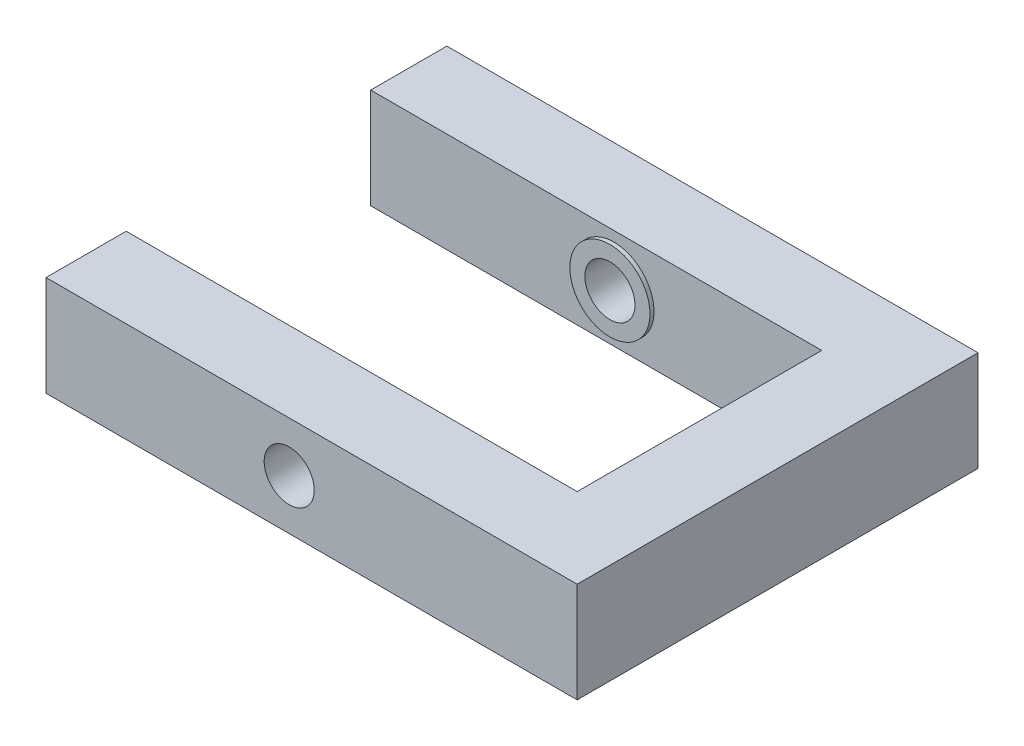
ISO-10303-21;
HEADER;
FILE_DESCRIPTION(('STEP AP214'),'2;1');
FILE_NAME('part.step','',(''),(''),'','','');
FILE_SCHEMA(('AUTOMOTIVE_DESIGN { 1 0 10303 214 1 1 1 1 }'));
ENDSEC;
DATA;
#1=APPLICATION_CONTEXT('core data for automotive mechanical design processes');
#2=APPLICATION_PROTOCOL_DEFINITION('international standard','automotive_design',2000,#1);
#3=PRODUCT_CONTEXT('',#1,'mechanical');
#4=PRODUCT('Part','Part','',(#3));
#5=PRODUCT_RELATED_PRODUCT_CATEGORY('part','',(#4));
#6=PRODUCT_DEFINITION_FORMATION('','',#4);
#7=PRODUCT_DEFINITION_CONTEXT('part definition',#1,'design');
#8=PRODUCT_DEFINITION('design','',#6,#7);
#9=PRODUCT_DEFINITION_SHAPE('','',#8);
#10=(LENGTH_UNIT() NAMED_UNIT(*) SI_UNIT(.MILLI.,.METRE.));
#11=(NAMED_UNIT(*) PLANE_ANGLE_UNIT() SI_UNIT($,.RADIAN.));
#12=(NAMED_UNIT(*) SI_UNIT($,.STERADIAN.) SOLID_ANGLE_UNIT());
#13=UNCERTAINTY_MEASURE_WITH_UNIT(LENGTH_MEASURE(1.E-05),#10,'distance_accuracy_value','');
#14=(GEOMETRIC_REPRESENTATION_CONTEXT(3) GLOBAL_UNCERTAINTY_ASSIGNED_CONTEXT((#13)) GLOBAL_UNIT_ASSIGNED_CONTEXT((#10,
#11,#12)) REPRESENTATION_CONTEXT('',''));
#15=CARTESIAN_POINT('',(0.,0.,0.));
#16=DIRECTION('',(0.,0.,1.));
#17=DIRECTION('',(1.,0.,0.));
#18=AXIS2_PLACEMENT_3D('',#15,#16,#17);
#19=CARTESIAN_POINT('',(0.,10.,-12.4));
#20=DIRECTION('',(0.,0.,-1.));
#21=DIRECTION('',(-1.,0.,0.));
#22=AXIS2_PLACEMENT_3D('',#19,#20,#21);
#23=PLANE('',#22);
#24=DIRECTION('',(1.,0.,0.));
#25=VECTOR('',#24,1.);
#26=CARTESIAN_POINT('',(0.,0.,-12.4));
#27=LINE('',#26,#25);
#28=CARTESIAN_POINT('',(0.,0.,-12.4));
#29=VERTEX_POINT('',#28);
#30=CARTESIAN_POINT('',(45.,0.,-12.4));
#31=VERTEX_POINT('',#30);
#32=EDGE_CURVE('E95',#29,#31,#27,.T.);
#33=ORIENTED_EDGE('',*,*,#32,.T.);
#34=DIRECTION('',(0.,-1.,0.));
#35=VECTOR('',#34,1.);
#36=CARTESIAN_POINT('',(45.,10.,-12.4));
#37=LINE('',#36,#35);
#38=CARTESIAN_POINT('',(45.,10.,-12.4));
#39=VERTEX_POINT('',#38);
#40=EDGE_CURVE('E139',#39,#31,#37,.T.);
#41=ORIENTED_EDGE('',*,*,#40,.F.);
#42=DIRECTION('',(1.,0.,0.));
#43=VECTOR('',#42,1.);
#44=CARTESIAN_POINT('',(0.,10.,-12.4));
#45=LINE('',#44,#43);
#46=CARTESIAN_POINT('',(0.,10.,-12.4));
#47=VERTEX_POINT('',#46);
#48=EDGE_CURVE('E137',#47,#39,#45,.T.);
#49=ORIENTED_EDGE('',*,*,#48,.F.);
#50=DIRECTION('',(0.,-1.,0.));
#51=VECTOR('',#50,1.);
#52=CARTESIAN_POINT('',(0.,10.,-12.4));
#53=LINE('',#52,#51);
#54=EDGE_CURVE('E133',#47,#29,#53,.T.);
#55=ORIENTED_EDGE('',*,*,#54,.T.);
#56=EDGE_LOOP('',(#33,#41,#49,#55));
#57=FACE_BOUND('',#56,.T.);
#58=CARTESIAN_POINT('',(24.27,5.,-12.4));
#59=DIRECTION('',(0.,0.,-1.));
#60=DIRECTION('',(-1.,0.,0.));
#61=AXIS2_PLACEMENT_3D('',#58,#59,#60);
#62=CIRCLE('',#61,4.);
#63=CARTESIAN_POINT('',(20.27,5.,-12.4));
#64=VERTEX_POINT('',#63);
#65=EDGE_CURVE('E11',#64,#64,#62,.F.);
#66=ORIENTED_EDGE('',*,*,#65,.F.);
#67=EDGE_LOOP('',(#66));
#68=FACE_BOUND('',#67,.T.);
#69=ADVANCED_FACE('F41',(#57,#68),#23,.F.);
#70=CARTESIAN_POINT('',(0.,10.,12.));
#71=DIRECTION('',(0.,0.,1.));
#72=DIRECTION('',(1.,0.,0.));
#73=AXIS2_PLACEMENT_3D('',#70,#71,#72);
#74=PLANE('',#73);
#75=CARTESIAN_POINT('',(24.27,5.,12.));
#76=DIRECTION('',(0.,0.,1.));
#77=DIRECTION('',(1.,0.,0.));
#78=AXIS2_PLACEMENT_3D('',#75,#76,#77);
#79=CIRCLE('',#78,2.5);
#80=CARTESIAN_POINT('',(26.77,5.,12.));
#81=VERTEX_POINT('',#80);
#82=EDGE_CURVE('E146',#81,#81,#79,.T.);
#83=ORIENTED_EDGE('',*,*,#82,.T.);
#84=EDGE_LOOP('',(#83));
#85=FACE_BOUND('',#84,.T.);
#86=DIRECTION('',(-1.,0.,0.));
#87=VECTOR('',#86,1.);
#88=CARTESIAN_POINT('',(0.,0.,12.));
#89=LINE('',#88,#87);
#90=CARTESIAN_POINT('',(45.,0.,12.));
#91=VERTEX_POINT('',#90);
#92=CARTESIAN_POINT('',(0.,0.,12.));
#93=VERTEX_POINT('',#92);
#94=EDGE_CURVE('E143',#91,#93,#89,.T.);
#95=ORIENTED_EDGE('',*,*,#94,.T.);
#96=DIRECTION('',(0.,-1.,0.));
#97=VECTOR('',#96,1.);
#98=CARTESIAN_POINT('',(0.,10.,12.));
#99=LINE('',#98,#97);
#100=CARTESIAN_POINT('',(0.,10.,12.));
#101=VERTEX_POINT('',#100);
#102=EDGE_CURVE('E166',#101,#93,#99,.T.);
#103=ORIENTED_EDGE('',*,*,#102,.F.);
#104=DIRECTION('',(-1.,0.,0.));
#105=VECTOR('',#104,1.);
#106=CARTESIAN_POINT('',(0.,10.,12.));
#107=LINE('',#106,#105);
#108=CARTESIAN_POINT('',(45.,10.,12.));
#109=VERTEX_POINT('',#108);
#110=EDGE_CURVE('E103',#109,#101,#107,.T.);
#111=ORIENTED_EDGE('',*,*,#110,.F.);
#112=DIRECTION('',(0.,-1.,0.));
#113=VECTOR('',#112,1.);
#114=CARTESIAN_POINT('',(45.,10.,12.));
#115=LINE('',#114,#113);
#116=EDGE_CURVE('E50',#109,#91,#115,.T.);
#117=ORIENTED_EDGE('',*,*,#116,.T.);
#118=EDGE_LOOP('',(#95,#103,#111,#117));
#119=FACE_BOUND('',#118,.T.);
#120=ADVANCED_FACE('F43',(#85,#119),#74,.F.);
#121=CARTESIAN_POINT('',(0.,10.,12.));
#122=DIRECTION('',(1.,0.,0.));
#123=DIRECTION('',(0.,0.,-1.));
#124=AXIS2_PLACEMENT_3D('',#121,#122,#123);
#125=PLANE('',#124);
#126=DIRECTION('',(0.,0.,1.));
#127=VECTOR('',#126,1.);
#128=CARTESIAN_POINT('',(0.,0.,12.));
#129=LINE('',#128,#127);
#130=CARTESIAN_POINT('',(0.,0.,20.));
#131=VERTEX_POINT('',#130);
#132=EDGE_CURVE('E145',#93,#131,#129,.T.);
#133=ORIENTED_EDGE('',*,*,#132,.T.);
#134=DIRECTION('',(0.,-1.,0.));
#135=VECTOR('',#134,1.);
#136=CARTESIAN_POINT('',(0.,10.,20.));
#137=LINE('',#136,#135);
#138=CARTESIAN_POINT('',(0.,10.,20.));
#139=VERTEX_POINT('',#138);
#140=EDGE_CURVE('E163',#139,#131,#137,.T.);
#141=ORIENTED_EDGE('',*,*,#140,.F.);
#142=DIRECTION('',(0.,0.,1.));
#143=VECTOR('',#142,1.);
#144=CARTESIAN_POINT('',(0.,10.,12.));
#145=LINE('',#144,#143);
#146=EDGE_CURVE('E185',#101,#139,#145,.T.);
#147=ORIENTED_EDGE('',*,*,#146,.F.);
#148=ORIENTED_EDGE('',*,*,#102,.T.);
#149=EDGE_LOOP('',(#133,#141,#147,#148));
#150=FACE_BOUND('',#149,.T.);
#151=ADVANCED_FACE('F178',(#150),#125,.F.);
#152=CARTESIAN_POINT('',(0.,10.,20.));
#153=DIRECTION('',(0.,0.,-1.));
#154=DIRECTION('',(-1.,0.,0.));
#155=AXIS2_PLACEMENT_3D('',#152,#153,#154);
#156=PLANE('',#155);
#157=CARTESIAN_POINT('',(24.27,5.,20.));
#158=DIRECTION('',(0.,0.,1.));
#159=DIRECTION('',(1.,0.,0.));
#160=AXIS2_PLACEMENT_3D('',#157,#158,#159);
#161=CIRCLE('',#160,2.5);
#162=CARTESIAN_POINT('',(26.77,5.,20.));
#163=VERTEX_POINT('',#162);
#164=EDGE_CURVE('E196',#163,#163,#161,.T.);
#165=ORIENTED_EDGE('',*,*,#164,.F.);
#166=EDGE_LOOP('',(#165));
#167=FACE_BOUND('',#166,.T.);
#168=DIRECTION('',(1.,0.,0.));
#169=VECTOR('',#168,1.);
#170=CARTESIAN_POINT('',(0.,0.,20.));
#171=LINE('',#170,#169);
#172=CARTESIAN_POINT('',(53.,0.,20.));
#173=VERTEX_POINT('',#172);
#174=EDGE_CURVE('E148',#131,#173,#171,.T.);
#175=ORIENTED_EDGE('',*,*,#174,.T.);
#176=DIRECTION('',(0.,-1.,0.));
#177=VECTOR('',#176,1.);
#178=CARTESIAN_POINT('',(53.,10.,20.));
#179=LINE('',#178,#177);
#180=CARTESIAN_POINT('',(53.,10.,20.));
#181=VERTEX_POINT('',#180);
#182=EDGE_CURVE('E160',#181,#173,#179,.T.);
#183=ORIENTED_EDGE('',*,*,#182,.F.);
#184=DIRECTION('',(1.,0.,0.));
#185=VECTOR('',#184,1.);
#186=CARTESIAN_POINT('',(0.,10.,20.));
#187=LINE('',#186,#185);
#188=EDGE_CURVE('E184',#139,#181,#187,.T.);
#189=ORIENTED_EDGE('',*,*,#188,.F.);
#190=ORIENTED_EDGE('',*,*,#140,.T.);
#191=EDGE_LOOP('',(#175,#183,#189,#190));
#192=FACE_BOUND('',#191,.T.);
#193=ADVANCED_FACE('F182',(#167,#192),#156,.F.);
#194=CARTESIAN_POINT('',(53.,10.,-20.));
#195=DIRECTION('',(-1.,0.,0.));
#196=DIRECTION('',(0.,0.,1.));
#197=AXIS2_PLACEMENT_3D('',#194,#195,#196);
#198=PLANE('',#197);
#199=DIRECTION('',(0.,0.,-1.));
#200=VECTOR('',#199,1.);
#201=CARTESIAN_POINT('',(53.,0.,-20.));
#202=LINE('',#201,#200);
#203=CARTESIAN_POINT('',(53.,0.,-20.));
#204=VERTEX_POINT('',#203);
#205=EDGE_CURVE('E150',#173,#204,#202,.T.);
#206=ORIENTED_EDGE('',*,*,#205,.T.);
#207=DIRECTION('',(0.,-1.,0.));
#208=VECTOR('',#207,1.);
#209=CARTESIAN_POINT('',(53.,10.,-20.));
#210=LINE('',#209,#208);
#211=CARTESIAN_POINT('',(53.,10.,-20.));
#212=VERTEX_POINT('',#211);
#213=EDGE_CURVE('E132',#212,#204,#210,.T.);
#214=ORIENTED_EDGE('',*,*,#213,.F.);
#215=DIRECTION('',(0.,0.,-1.));
#216=VECTOR('',#215,1.);
#217=CARTESIAN_POINT('',(53.,10.,-20.));
#218=LINE('',#217,#216);
#219=EDGE_CURVE('E123',#181,#212,#218,.T.);
#220=ORIENTED_EDGE('',*,*,#219,.F.);
#221=ORIENTED_EDGE('',*,*,#182,.T.);
#222=EDGE_LOOP('',(#206,#214,#220,#221));
#223=FACE_BOUND('',#222,.T.);
#224=ADVANCED_FACE('F236',(#223),#198,.F.);
#225=CARTESIAN_POINT('',(0.,10.,-20.));
#226=DIRECTION('',(0.,0.,1.));
#227=DIRECTION('',(1.,0.,0.));
#228=AXIS2_PLACEMENT_3D('',#225,#226,#227);
#229=PLANE('',#228);
#230=CARTESIAN_POINT('',(24.27,5.,-20.));
#231=DIRECTION('',(0.,0.,1.));
#232=DIRECTION('',(1.,0.,0.));
#233=AXIS2_PLACEMENT_3D('',#230,#231,#232);
#234=CIRCLE('',#233,2.5);
#235=CARTESIAN_POINT('',(26.77,5.,-20.));
#236=VERTEX_POINT('',#235);
#237=EDGE_CURVE('E193',#236,#236,#234,.T.);
#238=ORIENTED_EDGE('',*,*,#237,.T.);
#239=EDGE_LOOP('',(#238));
#240=FACE_BOUND('',#239,.T.);
#241=DIRECTION('',(-1.,0.,0.));
#242=VECTOR('',#241,1.);
#243=CARTESIAN_POINT('',(0.,0.,-20.));
#244=LINE('',#243,#242);
#245=CARTESIAN_POINT('',(0.,0.,-20.));
#246=VERTEX_POINT('',#245);
#247=EDGE_CURVE('E131',#204,#246,#244,.T.);
#248=ORIENTED_EDGE('',*,*,#247,.T.);
#249=DIRECTION('',(0.,-1.,0.));
#250=VECTOR('',#249,1.);
#251=CARTESIAN_POINT('',(0.,10.,-20.));
#252=LINE('',#251,#250);
#253=CARTESIAN_POINT('',(0.,10.,-20.));
#254=VERTEX_POINT('',#253);
#255=EDGE_CURVE('E128',#254,#246,#252,.T.);
#256=ORIENTED_EDGE('',*,*,#255,.F.);
#257=DIRECTION('',(-1.,0.,0.));
#258=VECTOR('',#257,1.);
#259=CARTESIAN_POINT('',(0.,10.,-20.));
#260=LINE('',#259,#258);
#261=EDGE_CURVE('E117',#212,#254,#260,.T.);
#262=ORIENTED_EDGE('',*,*,#261,.F.);
#263=ORIENTED_EDGE('',*,*,#213,.T.);
#264=EDGE_LOOP('',(#248,#256,#262,#263));
#265=FACE_BOUND('',#264,.T.);
#266=ADVANCED_FACE('F129',(#240,#265),#229,.F.);
#267=CARTESIAN_POINT('',(0.,10.,-20.));
#268=DIRECTION('',(1.,0.,0.));
#269=DIRECTION('',(0.,0.,-1.));
#270=AXIS2_PLACEMENT_3D('',#267,#268,#269);
#271=PLANE('',#270);
#272=DIRECTION('',(0.,0.,1.));
#273=VECTOR('',#272,1.);
#274=CARTESIAN_POINT('',(0.,0.,-20.));
#275=LINE('',#274,#273);
#276=EDGE_CURVE('E88',#246,#29,#275,.T.);
#277=ORIENTED_EDGE('',*,*,#276,.T.);
#278=ORIENTED_EDGE('',*,*,#54,.F.);
#279=DIRECTION('',(0.,0.,1.));
#280=VECTOR('',#279,1.);
#281=CARTESIAN_POINT('',(0.,10.,-20.));
#282=LINE('',#281,#280);
#283=EDGE_CURVE('E121',#254,#47,#282,.T.);
#284=ORIENTED_EDGE('',*,*,#283,.F.);
#285=ORIENTED_EDGE('',*,*,#255,.T.);
#286=EDGE_LOOP('',(#277,#278,#284,#285));
#287=FACE_BOUND('',#286,.T.);
#288=ADVANCED_FACE('F135',(#287),#271,.F.);
#289=CARTESIAN_POINT('',(45.,10.,-12.));
#290=DIRECTION('',(1.,0.,0.));
#291=DIRECTION('',(0.,0.,-1.));
#292=AXIS2_PLACEMENT_3D('',#289,#290,#291);
#293=PLANE('',#292);
#294=DIRECTION('',(0.,0.,1.));
#295=VECTOR('',#294,1.);
#296=CARTESIAN_POINT('',(45.,0.,-12.));
#297=LINE('',#296,#295);
#298=EDGE_CURVE('E155',#31,#91,#297,.T.);
#299=ORIENTED_EDGE('',*,*,#298,.T.);
#300=ORIENTED_EDGE('',*,*,#116,.F.);
#301=DIRECTION('',(0.,0.,1.));
#302=VECTOR('',#301,1.);
#303=CARTESIAN_POINT('',(45.,10.,-12.));
#304=LINE('',#303,#302);
#305=EDGE_CURVE('E58',#39,#109,#304,.T.);
#306=ORIENTED_EDGE('',*,*,#305,.F.);
#307=ORIENTED_EDGE('',*,*,#40,.T.);
#308=EDGE_LOOP('',(#299,#300,#306,#307));
#309=FACE_BOUND('',#308,.T.);
#310=ADVANCED_FACE('F169',(#309),#293,.F.);
#311=CARTESIAN_POINT('',(0.,10.,0.));
#312=DIRECTION('',(0.,1.,0.));
#313=DIRECTION('',(0.,0.,1.));
#314=AXIS2_PLACEMENT_3D('',#311,#312,#313);
#315=PLANE('',#314);
#316=ORIENTED_EDGE('',*,*,#305,.T.);
#317=ORIENTED_EDGE('',*,*,#110,.T.);
#318=ORIENTED_EDGE('',*,*,#146,.T.);
#319=ORIENTED_EDGE('',*,*,#188,.T.);
#320=ORIENTED_EDGE('',*,*,#219,.T.);
#321=ORIENTED_EDGE('',*,*,#261,.T.);
#322=ORIENTED_EDGE('',*,*,#283,.T.);
#323=ORIENTED_EDGE('',*,*,#48,.T.);
#324=EDGE_LOOP('',(#316,#317,#318,#319,#320,#321,#322,#323));
#325=FACE_BOUND('',#324,.T.);
#326=ADVANCED_FACE('F119',(#325),#315,.T.);
#327=CARTESIAN_POINT('',(0.,0.,0.));
#328=DIRECTION('',(0.,1.,0.));
#329=DIRECTION('',(0.,0.,1.));
#330=AXIS2_PLACEMENT_3D('',#327,#328,#329);
#331=PLANE('',#330);
#332=ORIENTED_EDGE('',*,*,#94,.F.);
#333=ORIENTED_EDGE('',*,*,#298,.F.);
#334=ORIENTED_EDGE('',*,*,#32,.F.);
#335=ORIENTED_EDGE('',*,*,#276,.F.);
#336=ORIENTED_EDGE('',*,*,#247,.F.);
#337=ORIENTED_EDGE('',*,*,#205,.F.);
#338=ORIENTED_EDGE('',*,*,#174,.F.);
#339=ORIENTED_EDGE('',*,*,#132,.F.);
#340=EDGE_LOOP('',(#332,#333,#334,#335,#336,#337,#338,#339));
#341=FACE_BOUND('',#340,.T.);
#342=ADVANCED_FACE('F173',(#341),#331,.F.);
#343=CARTESIAN_POINT('',(24.27,5.,-39.));
#344=DIRECTION('',(0.,0.,1.));
#345=DIRECTION('',(1.,0.,0.));
#346=AXIS2_PLACEMENT_3D('',#343,#344,#345);
#347=CYLINDRICAL_SURFACE('',#346,2.5);
#348=CARTESIAN_POINT('',(24.27,5.,-12.));
#349=DIRECTION('',(0.,0.,1.));
#350=DIRECTION('',(1.,0.,0.));
#351=AXIS2_PLACEMENT_3D('',#348,#349,#350);
#352=CIRCLE('',#351,2.5);
#353=CARTESIAN_POINT('',(26.77,5.,-12.));
#354=VERTEX_POINT('',#353);
#355=EDGE_CURVE('E202',#354,#354,#352,.T.);
#356=CARTESIAN_POINT('',(26.77,5.,-20.));
#357=CARTESIAN_POINT('',(26.77,5.,-19.9166666666667));
#358=CARTESIAN_POINT('',(26.77,5.,-19.8333333333333));
#359=CARTESIAN_POINT('',(26.77,5.,-19.6666666666667));
#360=CARTESIAN_POINT('',(26.77,5.,-19.5833333333333));
#361=CARTESIAN_POINT('',(26.77,5.,-19.4166666666667));
#362=CARTESIAN_POINT('',(26.77,5.,-19.3333333333333));
#363=CARTESIAN_POINT('',(26.77,5.,-19.1666666666667));
#364=CARTESIAN_POINT('',(26.77,5.,-19.0833333333333));
#365=CARTESIAN_POINT('',(26.77,5.,-18.9166666666667));
#366=CARTESIAN_POINT('',(26.77,5.,-18.8333333333333));
#367=CARTESIAN_POINT('',(26.77,5.,-18.6666666666667));
#368=CARTESIAN_POINT('',(26.77,5.,-18.5833333333333));
#369=CARTESIAN_POINT('',(26.77,5.,-18.4166666666667));
#370=CARTESIAN_POINT('',(26.77,5.,-18.3333333333333));
#371=CARTESIAN_POINT('',(26.77,5.,-18.1666666666667));
#372=CARTESIAN_POINT('',(26.77,5.,-18.0833333333333));
#373=CARTESIAN_POINT('',(26.77,5.,-17.9166666666667));
#374=CARTESIAN_POINT('',(26.77,5.,-17.8333333333333));
#375=CARTESIAN_POINT('',(26.77,5.,-17.6666666666667));
#376=CARTESIAN_POINT('',(26.77,5.,-17.5833333333333));
#377=CARTESIAN_POINT('',(26.77,5.,-17.4166666666667));
#378=CARTESIAN_POINT('',(26.77,5.,-17.3333333333333));
#379=CARTESIAN_POINT('',(26.77,5.,-17.1666666666667));
#380=CARTESIAN_POINT('',(26.77,5.,-17.0833333333333));
#381=CARTESIAN_POINT('',(26.77,5.,-16.9166666666667));
#382=CARTESIAN_POINT('',(26.77,5.,-16.8333333333333));
#383=CARTESIAN_POINT('',(26.77,5.,-16.6666666666667));
#384=CARTESIAN_POINT('',(26.77,5.,-16.5833333333333));
#385=CARTESIAN_POINT('',(26.77,5.,-16.4166666666667));
#386=CARTESIAN_POINT('',(26.77,5.,-16.3333333333333));
#387=CARTESIAN_POINT('',(26.77,5.,-16.1666666666667));
#388=CARTESIAN_POINT('',(26.77,5.,-16.0833333333333));
#389=CARTESIAN_POINT('',(26.77,5.,-15.9166666666667));
#390=CARTESIAN_POINT('',(26.77,5.,-15.8333333333333));
#391=CARTESIAN_POINT('',(26.77,5.,-15.6666666666667));
#392=CARTESIAN_POINT('',(26.77,5.,-15.5833333333333));
#393=CARTESIAN_POINT('',(26.77,5.,-15.4166666666667));
#394=CARTESIAN_POINT('',(26.77,5.,-15.3333333333333));
#395=CARTESIAN_POINT('',(26.77,5.,-15.1666666666667));
#396=CARTESIAN_POINT('',(26.77,5.,-15.0833333333333));
#397=CARTESIAN_POINT('',(26.77,5.,-14.9166666666667));
#398=CARTESIAN_POINT('',(26.77,5.,-14.8333333333333));
#399=CARTESIAN_POINT('',(26.77,5.,-14.6666666666667));
#400=CARTESIAN_POINT('',(26.77,5.,-14.5833333333333));
#401=CARTESIAN_POINT('',(26.77,5.,-14.4166666666667));
#402=CARTESIAN_POINT('',(26.77,5.,-14.3333333333333));
#403=CARTESIAN_POINT('',(26.77,5.,-14.1666666666667));
#404=CARTESIAN_POINT('',(26.77,5.,-14.0833333333333));
#405=CARTESIAN_POINT('',(26.77,5.,-13.9166666666667));
#406=CARTESIAN_POINT('',(26.77,5.,-13.8333333333333));
#407=CARTESIAN_POINT('',(26.77,5.,-13.6666666666667));
#408=CARTESIAN_POINT('',(26.77,5.,-13.5833333333333));
#409=CARTESIAN_POINT('',(26.77,5.,-13.4166666666667));
#410=CARTESIAN_POINT('',(26.77,5.,-13.3333333333333));
#411=CARTESIAN_POINT('',(26.77,5.,-13.1666666666667));
#412=CARTESIAN_POINT('',(26.77,5.,-13.0833333333333));
#413=CARTESIAN_POINT('',(26.77,5.,-12.9166666666667));
#414=CARTESIAN_POINT('',(26.77,5.,-12.8333333333333));
#415=CARTESIAN_POINT('',(26.77,5.,-12.6666666666667));
#416=CARTESIAN_POINT('',(26.77,5.,-12.5833333333333));
#417=CARTESIAN_POINT('',(26.77,5.,-12.4166666666667));
#418=CARTESIAN_POINT('',(26.77,5.,-12.3333333333333));
#419=CARTESIAN_POINT('',(26.77,5.,-12.1666666666667));
#420=CARTESIAN_POINT('',(26.77,5.,-12.0833333333333));
#421=CARTESIAN_POINT('',(26.77,5.,-12.));
#422=B_SPLINE_CURVE_WITH_KNOTS('',3,(#356,#357,#358,#359,#360,#361,#362,#363,#364,#365,#366,
#367,#368,#369,#370,#371,#372,#373,#374,#375,#376,#377,#378,#379,#380,#381,#382,#383,#384,#385,
#386,#387,#388,#389,#390,#391,#392,#393,#394,#395,#396,#397,#398,#399,#400,#401,#402,#403,#404,
#405,#406,#407,#408,#409,#410,#411,#412,#413,#414,#415,#416,#417,#418,#419,#420,#421),
.UNSPECIFIED.,.F.,.F.,(4,2,2,2,2,2,2,2,2,2,2,2,2,2,2,2,2,2,2,2,2,2,2,2,2,2,2,2,2,2,2,2,4),(0.,
0.25,0.5,0.750000000000001,1.,1.25,1.5,1.75,2.,2.25,2.5,2.75,3.,3.25,3.5,3.75,4.,4.25,4.5,4.75,
5.,5.25,5.5,5.75,6.,6.25,6.5,6.75,7.,7.25,7.5,7.75,8.),.UNSPECIFIED.);
#423=EDGE_CURVE('BSEAM206',#236,#354,#422,.T.);
#424=ORIENTED_EDGE('',*,*,#237,.F.);
#425=ORIENTED_EDGE('',*,*,#355,.T.);
#426=ORIENTED_EDGE('',*,*,#423,.T.);
#427=ORIENTED_EDGE('',*,*,#423,.F.);
#428=EDGE_LOOP('',(#424,#426,#425,#427));
#429=FACE_BOUND('',#428,.T.);
#430=ADVANCED_FACE('F206',(#429),#347,.F.);
#431=CARTESIAN_POINT('',(26.77,5.,20.));
#432=CARTESIAN_POINT('',(26.77,5.,19.9166666666667));
#433=CARTESIAN_POINT('',(26.77,5.,19.8333333333333));
#434=CARTESIAN_POINT('',(26.77,5.,19.6666666666667));
#435=CARTESIAN_POINT('',(26.77,5.,19.5833333333333));
#436=CARTESIAN_POINT('',(26.77,5.,19.4166666666667));
#437=CARTESIAN_POINT('',(26.77,5.,19.3333333333333));
#438=CARTESIAN_POINT('',(26.77,5.,19.1666666666667));
#439=CARTESIAN_POINT('',(26.77,5.,19.0833333333333));
#440=CARTESIAN_POINT('',(26.77,5.,18.9166666666667));
#441=CARTESIAN_POINT('',(26.77,5.,18.8333333333333));
#442=CARTESIAN_POINT('',(26.77,5.,18.6666666666667));
#443=CARTESIAN_POINT('',(26.77,5.,18.5833333333333));
#444=CARTESIAN_POINT('',(26.77,5.,18.4166666666667));
#445=CARTESIAN_POINT('',(26.77,5.,18.3333333333333));
#446=CARTESIAN_POINT('',(26.77,5.,18.1666666666667));
#447=CARTESIAN_POINT('',(26.77,5.,18.0833333333333));
#448=CARTESIAN_POINT('',(26.77,5.,17.9166666666667));
#449=CARTESIAN_POINT('',(26.77,5.,17.8333333333333));
#450=CARTESIAN_POINT('',(26.77,5.,17.6666666666667));
#451=CARTESIAN_POINT('',(26.77,5.,17.5833333333333));
#452=CARTESIAN_POINT('',(26.77,5.,17.4166666666667));
#453=CARTESIAN_POINT('',(26.77,5.,17.3333333333333));
#454=CARTESIAN_POINT('',(26.77,5.,17.1666666666667));
#455=CARTESIAN_POINT('',(26.77,5.,17.0833333333333));
#456=CARTESIAN_POINT('',(26.77,5.,16.9166666666667));
#457=CARTESIAN_POINT('',(26.77,5.,16.8333333333333));
#458=CARTESIAN_POINT('',(26.77,5.,16.6666666666667));
#459=CARTESIAN_POINT('',(26.77,5.,16.5833333333333));
#460=CARTESIAN_POINT('',(26.77,5.,16.4166666666667));
#461=CARTESIAN_POINT('',(26.77,5.,16.3333333333333));
#462=CARTESIAN_POINT('',(26.77,5.,16.1666666666667));
#463=CARTESIAN_POINT('',(26.77,5.,16.0833333333333));
#464=CARTESIAN_POINT('',(26.77,5.,15.9166666666667));
#465=CARTESIAN_POINT('',(26.77,5.,15.8333333333333));
#466=CARTESIAN_POINT('',(26.77,5.,15.6666666666667));
#467=CARTESIAN_POINT('',(26.77,5.,15.5833333333333));
#468=CARTESIAN_POINT('',(26.77,5.,15.4166666666667));
#469=CARTESIAN_POINT('',(26.77,5.,15.3333333333333));
#470=CARTESIAN_POINT('',(26.77,5.,15.1666666666667));
#471=CARTESIAN_POINT('',(26.77,5.,15.0833333333333));
#472=CARTESIAN_POINT('',(26.77,5.,14.9166666666667));
#473=CARTESIAN_POINT('',(26.77,5.,14.8333333333333));
#474=CARTESIAN_POINT('',(26.77,5.,14.6666666666667));
#475=CARTESIAN_POINT('',(26.77,5.,14.5833333333333));
#476=CARTESIAN_POINT('',(26.77,5.,14.4166666666667));
#477=CARTESIAN_POINT('',(26.77,5.,14.3333333333333));
#478=CARTESIAN_POINT('',(26.77,5.,14.1666666666667));
#479=CARTESIAN_POINT('',(26.77,5.,14.0833333333333));
#480=CARTESIAN_POINT('',(26.77,5.,13.9166666666667));
#481=CARTESIAN_POINT('',(26.77,5.,13.8333333333333));
#482=CARTESIAN_POINT('',(26.77,5.,13.6666666666667));
#483=CARTESIAN_POINT('',(26.77,5.,13.5833333333333));
#484=CARTESIAN_POINT('',(26.77,5.,13.4166666666667));
#485=CARTESIAN_POINT('',(26.77,5.,13.3333333333333));
#486=CARTESIAN_POINT('',(26.77,5.,13.1666666666667));
#487=CARTESIAN_POINT('',(26.77,5.,13.0833333333333));
#488=CARTESIAN_POINT('',(26.77,5.,12.9166666666667));
#489=CARTESIAN_POINT('',(26.77,5.,12.8333333333333));
#490=CARTESIAN_POINT('',(26.77,5.,12.6666666666667));
#491=CARTESIAN_POINT('',(26.77,5.,12.5833333333333));
#492=CARTESIAN_POINT('',(26.77,5.,12.4166666666667));
#493=CARTESIAN_POINT('',(26.77,5.,12.3333333333333));
#494=CARTESIAN_POINT('',(26.77,5.,12.1666666666667));
#495=CARTESIAN_POINT('',(26.77,5.,12.0833333333333));
#496=CARTESIAN_POINT('',(26.77,5.,12.));
#497=B_SPLINE_CURVE_WITH_KNOTS('',3,(#431,#432,#433,#434,#435,#436,#437,#438,#439,#440,#441,
#442,#443,#444,#445,#446,#447,#448,#449,#450,#451,#452,#453,#454,#455,#456,#457,#458,#459,#460,
#461,#462,#463,#464,#465,#466,#467,#468,#469,#470,#471,#472,#473,#474,#475,#476,#477,#478,#479,
#480,#481,#482,#483,#484,#485,#486,#487,#488,#489,#490,#491,#492,#493,#494,#495,#496),
.UNSPECIFIED.,.F.,.F.,(4,2,2,2,2,2,2,2,2,2,2,2,2,2,2,2,2,2,2,2,2,2,2,2,2,2,2,2,2,2,2,2,4),(0.,
0.25,0.5,0.750000000000001,1.,1.25,1.5,1.75,2.,2.25,2.5,2.75,3.,3.25,3.5,3.75,4.,4.25,4.5,4.75,
5.,5.25,5.50000000000001,5.75000000000001,6.00000000000001,6.25000000000001,6.50000000000001,
6.75000000000001,7.00000000000001,7.25000000000001,7.50000000000001,7.75000000000001,
8.00000000000001),.UNSPECIFIED.);
#498=EDGE_CURVE('BSEAM211',#163,#81,#497,.T.);
#499=ORIENTED_EDGE('',*,*,#164,.T.);
#500=ORIENTED_EDGE('',*,*,#82,.F.);
#501=ORIENTED_EDGE('',*,*,#498,.T.);
#502=ORIENTED_EDGE('',*,*,#498,.F.);
#503=EDGE_LOOP('',(#499,#501,#500,#502));
#504=FACE_BOUND('',#503,.T.);
#505=ADVANCED_FACE('F211',(#504),#347,.F.);
#506=CARTESIAN_POINT('',(24.27,5.,-12.));
#507=DIRECTION('',(0.,0.,1.));
#508=DIRECTION('',(1.,0.,0.));
#509=AXIS2_PLACEMENT_3D('',#506,#507,#508);
#510=PLANE('',#509);
#511=CARTESIAN_POINT('',(24.27,5.,-12.));
#512=DIRECTION('',(0.,0.,1.));
#513=DIRECTION('',(1.,0.,0.));
#514=AXIS2_PLACEMENT_3D('',#511,#512,#513);
#515=CIRCLE('',#514,4.);
#516=CARTESIAN_POINT('',(28.27,5.,-12.));
#517=VERTEX_POINT('',#516);
#518=EDGE_CURVE('E199',#517,#517,#515,.T.);
#519=ORIENTED_EDGE('',*,*,#518,.T.);
#520=EDGE_LOOP('',(#519));
#521=FACE_BOUND('',#520,.T.);
#522=ORIENTED_EDGE('',*,*,#355,.F.);
#523=EDGE_LOOP('',(#522));
#524=FACE_BOUND('',#523,.T.);
#525=ADVANCED_FACE('F208',(#521,#524),#510,.T.);
#526=CARTESIAN_POINT('',(24.27,5.,-12.));
#527=DIRECTION('',(0.,0.,-1.));
#528=DIRECTION('',(-1.,0.,0.));
#529=AXIS2_PLACEMENT_3D('',#526,#527,#528);
#530=CYLINDRICAL_SURFACE('',#529,4.);
#531=ORIENTED_EDGE('',*,*,#518,.F.);
#532=EDGE_LOOP('',(#531));
#533=FACE_BOUND('',#532,.T.);
#534=ORIENTED_EDGE('',*,*,#65,.T.);
#535=EDGE_LOOP('',(#534));
#536=FACE_BOUND('',#535,.T.);
#537=ADVANCED_FACE('F210',(#533,#536),#530,.T.);
#538=CLOSED_SHELL('',(#69,#120,#151,#193,#224,#266,#288,#310,#326,#342,#430,#505,#525,#537));
#539=MANIFOLD_SOLID_BREP('B2',#538);
#540=ADVANCED_BREP_SHAPE_REPRESENTATION('',(#18,#539),#14);
#541=SHAPE_DEFINITION_REPRESENTATION(#9,#540);
ENDSEC;
END-ISO-10303-21;
